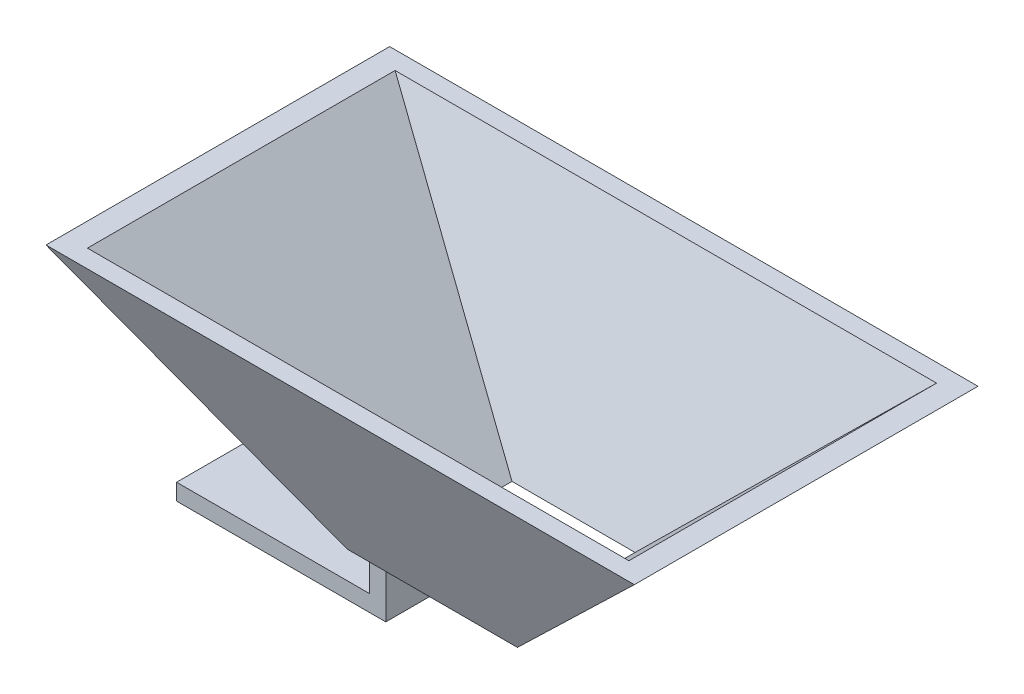
ISO-10303-21;
HEADER;
FILE_DESCRIPTION(('STEP AP214'),'2;1');
FILE_NAME('part.step','',(''),(''),'','','');
FILE_SCHEMA(('AUTOMOTIVE_DESIGN { 1 0 10303 214 1 1 1 1 }'));
ENDSEC;
DATA;
#1=APPLICATION_CONTEXT('core data for automotive mechanical design processes');
#2=APPLICATION_PROTOCOL_DEFINITION('international standard','automotive_design',2000,#1);
#3=PRODUCT_CONTEXT('',#1,'mechanical');
#4=PRODUCT('Part','Part','',(#3));
#5=PRODUCT_RELATED_PRODUCT_CATEGORY('part','',(#4));
#6=PRODUCT_DEFINITION_FORMATION('','',#4);
#7=PRODUCT_DEFINITION_CONTEXT('part definition',#1,'design');
#8=PRODUCT_DEFINITION('design','',#6,#7);
#9=PRODUCT_DEFINITION_SHAPE('','',#8);
#10=(LENGTH_UNIT() NAMED_UNIT(*) SI_UNIT(.MILLI.,.METRE.));
#11=(NAMED_UNIT(*) PLANE_ANGLE_UNIT() SI_UNIT($,.RADIAN.));
#12=(NAMED_UNIT(*) SI_UNIT($,.STERADIAN.) SOLID_ANGLE_UNIT());
#13=UNCERTAINTY_MEASURE_WITH_UNIT(LENGTH_MEASURE(1.E-05),#10,'distance_accuracy_value','');
#14=(GEOMETRIC_REPRESENTATION_CONTEXT(3) GLOBAL_UNCERTAINTY_ASSIGNED_CONTEXT((#13)) GLOBAL_UNIT_ASSIGNED_CONTEXT((#10,
#11,#12)) REPRESENTATION_CONTEXT('',''));
#15=CARTESIAN_POINT('',(0.,0.,0.));
#16=DIRECTION('',(0.,0.,1.));
#17=DIRECTION('',(1.,0.,0.));
#18=AXIS2_PLACEMENT_3D('',#15,#16,#17);
#19=CARTESIAN_POINT('',(-24.7137028274141,0.,10.0496971461617));
#20=DIRECTION('',(1.,0.,0.));
#21=DIRECTION('',(0.,0.,-1.));
#22=AXIS2_PLACEMENT_3D('',#19,#20,#21);
#23=PLANE('',#22);
#24=DIRECTION('',(0.,0.,-1.));
#25=VECTOR('',#24,1.);
#26=CARTESIAN_POINT('',(-24.7137028274141,-16.,10.0496971461617));
#27=LINE('',#26,#25);
#28=CARTESIAN_POINT('',(-24.7137028274141,-16.,10.0496971461617));
#29=VERTEX_POINT('',#28);
#30=CARTESIAN_POINT('',(-24.7137028274141,-16.,-9.95030285383827));
#31=VERTEX_POINT('',#30);
#32=EDGE_CURVE('E228',#29,#31,#27,.T.);
#33=ORIENTED_EDGE('',*,*,#32,.F.);
#34=DIRECTION('',(0.,-1.,0.));
#35=VECTOR('',#34,1.);
#36=CARTESIAN_POINT('',(-24.7137028274141,0.,10.0496971461617));
#37=LINE('',#36,#35);
#38=CARTESIAN_POINT('',(-24.7137028274141,-1.6801008111903,10.0496971461617));
#39=VERTEX_POINT('',#38);
#40=EDGE_CURVE('E234',#39,#29,#37,.T.);
#41=ORIENTED_EDGE('',*,*,#40,.F.);
#42=DIRECTION('',(0.,0.,-1.));
#43=VECTOR('',#42,1.);
#44=CARTESIAN_POINT('',(-24.7137028274141,-1.68010081119031,0.));
#45=LINE('',#44,#43);
#46=CARTESIAN_POINT('',(-24.7137028274141,-1.6801008111903,-9.95030285383827));
#47=VERTEX_POINT('',#46);
#48=EDGE_CURVE('E13',#39,#47,#45,.T.);
#49=ORIENTED_EDGE('',*,*,#48,.T.);
#50=DIRECTION('',(0.,-1.,0.));
#51=VECTOR('',#50,1.);
#52=CARTESIAN_POINT('',(-24.7137028274141,0.,-9.95030285383827));
#53=LINE('',#52,#51);
#54=EDGE_CURVE('E236',#47,#31,#53,.T.);
#55=ORIENTED_EDGE('',*,*,#54,.T.);
#56=EDGE_LOOP('',(#33,#41,#49,#55));
#57=FACE_BOUND('',#56,.T.);
#58=ADVANCED_FACE('F96',(#57),#23,.F.);
#59=CARTESIAN_POINT('',(-12.9520709933485,-13.2111124132154,0.));
#60=DIRECTION('',(0.700071410926057,0.714072839144579,0.));
#61=DIRECTION('',(-0.714072839144579,0.700071410926057,0.));
#62=AXIS2_PLACEMENT_3D('',#59,#60,#61);
#63=PLANE('',#62);
#64=ORIENTED_EDGE('',*,*,#48,.F.);
#65=DIRECTION('',(-0.714072839144579,0.700071410926057,0.));
#66=VECTOR('',#65,1.);
#67=CARTESIAN_POINT('',(-23.5139884711183,-2.85629135657831,10.0496971461617));
#68=LINE('',#67,#66);
#69=CARTESIAN_POINT('',(-59.2176304283473,32.1472791897246,10.0496971461617));
#70=VERTEX_POINT('',#69);
#71=EDGE_CURVE('E276',#39,#70,#68,.T.);
#72=ORIENTED_EDGE('',*,*,#71,.T.);
#73=DIRECTION('',(0.,0.,-1.));
#74=VECTOR('',#73,1.);
#75=CARTESIAN_POINT('',(-59.2176304283473,32.1472791897246,10.0496971461617));
#76=LINE('',#75,#74);
#77=CARTESIAN_POINT('',(-59.2176304283473,32.1472791897246,-9.95030285383827));
#78=VERTEX_POINT('',#77);
#79=EDGE_CURVE('E279',#70,#78,#76,.T.);
#80=ORIENTED_EDGE('',*,*,#79,.T.);
#81=DIRECTION('',(0.714072839144579,-0.700071410926057,0.));
#82=VECTOR('',#81,1.);
#83=CARTESIAN_POINT('',(-59.2176304283473,32.1472791897246,-9.95030285383827));
#84=LINE('',#83,#82);
#85=EDGE_CURVE('E116',#78,#47,#84,.T.);
#86=ORIENTED_EDGE('',*,*,#85,.T.);
#87=EDGE_LOOP('',(#64,#72,#80,#86));
#88=FACE_BOUND('',#87,.T.);
#89=ADVANCED_FACE('F437',(#88),#63,.F.);
#90=CARTESIAN_POINT('',(-17.8002856437042,-2.85629135657831,-15.));
#91=DIRECTION('',(-0.700071410926057,-0.714072839144579,0.));
#92=DIRECTION('',(0.,0.,1.));
#93=AXIS2_PLACEMENT_3D('',#90,#91,#92);
#94=PLANE('',#93);
#95=DIRECTION('',(0.,0.,1.));
#96=VECTOR('',#95,1.);
#97=CARTESIAN_POINT('',(-20.7137028274141,0.,0.));
#98=LINE('',#97,#96);
#99=CARTESIAN_POINT('',(-20.7137028274141,0.,-19.3863424398923));
#100=VERTEX_POINT('',#99);
#101=CARTESIAN_POINT('',(-20.7137028274141,0.,-9.95030285383827));
#102=VERTEX_POINT('',#101);
#103=EDGE_CURVE('E374',#100,#102,#98,.T.);
#104=ORIENTED_EDGE('',*,*,#103,.T.);
#105=DIRECTION('',(0.714072839144579,-0.700071410926057,0.));
#106=VECTOR('',#105,1.);
#107=CARTESIAN_POINT('',(-56.4173447846431,35.0035705463029,-9.95030285383827));
#108=LINE('',#107,#106);
#109=CARTESIAN_POINT('',(-56.4173447846431,35.0035705463029,-9.95030285383827));
#110=VERTEX_POINT('',#109);
#111=EDGE_CURVE('E265',#110,#102,#108,.T.);
#112=ORIENTED_EDGE('',*,*,#111,.F.);
#113=DIRECTION('',(0.,0.,-1.));
#114=VECTOR('',#113,1.);
#115=CARTESIAN_POINT('',(-56.4173447846431,35.0035705463029,10.0496971461617));
#116=LINE('',#115,#114);
#117=CARTESIAN_POINT('',(-56.4173447846431,35.0035705463029,10.0496971461617));
#118=VERTEX_POINT('',#117);
#119=EDGE_CURVE('E311',#118,#110,#116,.T.);
#120=ORIENTED_EDGE('',*,*,#119,.F.);
#121=DIRECTION('',(-0.714072839144579,0.700071410926057,0.));
#122=VECTOR('',#121,1.);
#123=CARTESIAN_POINT('',(-20.7137028274141,0.,10.0496971461617));
#124=LINE('',#123,#122);
#125=CARTESIAN_POINT('',(-20.7137028274141,0.,10.0496971461617));
#126=VERTEX_POINT('',#125);
#127=EDGE_CURVE('E315',#126,#118,#124,.T.);
#128=ORIENTED_EDGE('',*,*,#127,.F.);
#129=CARTESIAN_POINT('',(-20.7137028274141,0.,19.3863424398923));
#130=VERTEX_POINT('',#129);
#131=EDGE_CURVE('E365',#126,#130,#98,.T.);
#132=ORIENTED_EDGE('',*,*,#131,.T.);
#133=DIRECTION('',(-0.681075434754826,0.667721014465515,0.300474456509482));
#134=VECTOR('',#133,1.);
#135=CARTESIAN_POINT('',(-11.0263036560056,-9.49745016804757,15.1124898642709));
#136=LINE('',#135,#134);
#137=CARTESIAN_POINT('',(-71.7137028274141,50.,41.8863424398923));
#138=VERTEX_POINT('',#137);
#139=EDGE_CURVE('E362',#130,#138,#136,.T.);
#140=ORIENTED_EDGE('',*,*,#139,.T.);
#141=DIRECTION('',(0.,0.,1.));
#142=VECTOR('',#141,1.);
#143=CARTESIAN_POINT('',(-71.7137028274141,50.,0.));
#144=LINE('',#143,#142);
#145=CARTESIAN_POINT('',(-71.7137028274141,50.,-41.8863424398923));
#146=VERTEX_POINT('',#145);
#147=EDGE_CURVE('E329',#146,#138,#144,.T.);
#148=ORIENTED_EDGE('',*,*,#147,.F.);
#149=DIRECTION('',(-0.681075434754826,0.667721014465515,-0.300474456509482));
#150=VECTOR('',#149,1.);
#151=CARTESIAN_POINT('',(-3.2497643542088,-17.121508307064,-11.6816637017134));
#152=LINE('',#151,#150);
#153=EDGE_CURVE('E371',#100,#146,#152,.T.);
#154=ORIENTED_EDGE('',*,*,#153,.F.);
#155=EDGE_LOOP('',(#104,#112,#120,#128,#132,#140,#148,#154));
#156=FACE_BOUND('',#155,.T.);
#157=ADVANCED_FACE('F98',(#156),#94,.T.);
#158=CARTESIAN_POINT('',(-15.,-1.64145870931519,18.6476860207004));
#159=DIRECTION('',(0.,-0.410364677328798,0.911921505175107));
#160=DIRECTION('',(1.,0.,0.));
#161=AXIS2_PLACEMENT_3D('',#158,#159,#160);
#162=PLANE('',#161);
#163=DIRECTION('',(1.,0.,0.));
#164=VECTOR('',#163,1.);
#165=CARTESIAN_POINT('',(0.,0.,19.3863424398923));
#166=LINE('',#165,#164);
#167=CARTESIAN_POINT('',(20.7137028274141,0.,19.3863424398923));
#168=VERTEX_POINT('',#167);
#169=EDGE_CURVE('E106',#130,#168,#166,.T.);
#170=ORIENTED_EDGE('',*,*,#169,.T.);
#171=DIRECTION('',(0.681075434754825,0.667721014465515,0.300474456509482));
#172=VECTOR('',#171,1.);
#173=CARTESIAN_POINT('',(3.24976435420881,-17.121508307064,11.6816637017135));
#174=LINE('',#173,#172);
#175=CARTESIAN_POINT('',(71.7137028274141,50.,41.8863424398923));
#176=VERTEX_POINT('',#175);
#177=EDGE_CURVE('E358',#168,#176,#174,.T.);
#178=ORIENTED_EDGE('',*,*,#177,.T.);
#179=DIRECTION('',(1.,0.,0.));
#180=VECTOR('',#179,1.);
#181=CARTESIAN_POINT('',(0.,50.,41.8863424398923));
#182=LINE('',#181,#180);
#183=EDGE_CURVE('E366',#138,#176,#182,.T.);
#184=ORIENTED_EDGE('',*,*,#183,.F.);
#185=ORIENTED_EDGE('',*,*,#139,.F.);
#186=EDGE_LOOP('',(#170,#178,#184,#185));
#187=FACE_BOUND('',#186,.T.);
#188=ADVANCED_FACE('F397',(#187),#162,.T.);
#189=CARTESIAN_POINT('',(17.8002856437042,-2.85629135657831,15.));
#190=DIRECTION('',(0.700071410926058,-0.714072839144579,0.));
#191=DIRECTION('',(0.,0.,-1.));
#192=AXIS2_PLACEMENT_3D('',#189,#190,#191);
#193=PLANE('',#192);
#194=DIRECTION('',(0.,0.,-1.));
#195=VECTOR('',#194,1.);
#196=CARTESIAN_POINT('',(20.7137028274141,0.,0.));
#197=LINE('',#196,#195);
#198=CARTESIAN_POINT('',(20.7137028274141,0.,-19.3863424398923));
#199=VERTEX_POINT('',#198);
#200=EDGE_CURVE('E361',#168,#199,#197,.T.);
#201=ORIENTED_EDGE('',*,*,#200,.T.);
#202=DIRECTION('',(0.681075434754826,0.667721014465515,-0.300474456509482));
#203=VECTOR('',#202,1.);
#204=CARTESIAN_POINT('',(11.0263036560056,-9.49745016804758,-15.1124898642708));
#205=LINE('',#204,#203);
#206=CARTESIAN_POINT('',(71.7137028274141,50.,-41.8863424398923));
#207=VERTEX_POINT('',#206);
#208=EDGE_CURVE('E367',#199,#207,#205,.T.);
#209=ORIENTED_EDGE('',*,*,#208,.T.);
#210=DIRECTION('',(0.,0.,-1.));
#211=VECTOR('',#210,1.);
#212=CARTESIAN_POINT('',(71.7137028274141,50.,0.));
#213=LINE('',#212,#211);
#214=EDGE_CURVE('E385',#176,#207,#213,.T.);
#215=ORIENTED_EDGE('',*,*,#214,.F.);
#216=ORIENTED_EDGE('',*,*,#177,.F.);
#217=EDGE_LOOP('',(#201,#209,#215,#216));
#218=FACE_BOUND('',#217,.T.);
#219=ADVANCED_FACE('F405',(#218),#193,.T.);
#220=CARTESIAN_POINT('',(15.,-1.64145870931519,-18.6476860207004));
#221=DIRECTION('',(0.,-0.410364677328798,-0.911921505175106));
#222=DIRECTION('',(-1.,0.,0.));
#223=AXIS2_PLACEMENT_3D('',#220,#221,#222);
#224=PLANE('',#223);
#225=DIRECTION('',(-1.,0.,0.));
#226=VECTOR('',#225,1.);
#227=CARTESIAN_POINT('',(0.,0.,-19.3863424398923));
#228=LINE('',#227,#226);
#229=EDGE_CURVE('E370',#199,#100,#228,.T.);
#230=ORIENTED_EDGE('',*,*,#229,.T.);
#231=ORIENTED_EDGE('',*,*,#153,.T.);
#232=DIRECTION('',(-1.,0.,0.));
#233=VECTOR('',#232,1.);
#234=CARTESIAN_POINT('',(0.,50.,-41.8863424398923));
#235=LINE('',#234,#233);
#236=EDGE_CURVE('E388',#207,#146,#235,.T.);
#237=ORIENTED_EDGE('',*,*,#236,.F.);
#238=ORIENTED_EDGE('',*,*,#208,.F.);
#239=EDGE_LOOP('',(#230,#231,#237,#238));
#240=FACE_BOUND('',#239,.T.);
#241=ADVANCED_FACE('F408',(#240),#224,.T.);
#242=CARTESIAN_POINT('',(0.,0.,0.));
#243=DIRECTION('',(0.,1.,0.));
#244=DIRECTION('',(0.,0.,1.));
#245=AXIS2_PLACEMENT_3D('',#242,#243,#244);
#246=PLANE('',#245);
#247=DIRECTION('',(-1.,0.,0.));
#248=VECTOR('',#247,1.);
#249=CARTESIAN_POINT('',(0.,0.,-15.));
#250=LINE('',#249,#248);
#251=CARTESIAN_POINT('',(15.,0.,-15.));
#252=VERTEX_POINT('',#251);
#253=CARTESIAN_POINT('',(-15.,0.,-15.));
#254=VERTEX_POINT('',#253);
#255=EDGE_CURVE('E339',#252,#254,#250,.T.);
#256=ORIENTED_EDGE('',*,*,#255,.T.);
#257=DIRECTION('',(0.,0.,1.));
#258=VECTOR('',#257,1.);
#259=CARTESIAN_POINT('',(-15.,0.,0.));
#260=LINE('',#259,#258);
#261=CARTESIAN_POINT('',(-15.,0.,15.));
#262=VERTEX_POINT('',#261);
#263=EDGE_CURVE('E344',#254,#262,#260,.T.);
#264=ORIENTED_EDGE('',*,*,#263,.T.);
#265=DIRECTION('',(1.,0.,0.));
#266=VECTOR('',#265,1.);
#267=CARTESIAN_POINT('',(0.,0.,15.));
#268=LINE('',#267,#266);
#269=CARTESIAN_POINT('',(15.,0.,15.));
#270=VERTEX_POINT('',#269);
#271=EDGE_CURVE('E326',#262,#270,#268,.T.);
#272=ORIENTED_EDGE('',*,*,#271,.T.);
#273=DIRECTION('',(0.,0.,-1.));
#274=VECTOR('',#273,1.);
#275=CARTESIAN_POINT('',(15.,0.,0.));
#276=LINE('',#275,#274);
#277=EDGE_CURVE('E333',#270,#252,#276,.T.);
#278=ORIENTED_EDGE('',*,*,#277,.T.);
#279=EDGE_LOOP('',(#256,#264,#272,#278));
#280=FACE_BOUND('',#279,.T.);
#281=ORIENTED_EDGE('',*,*,#103,.F.);
#282=ORIENTED_EDGE('',*,*,#229,.F.);
#283=ORIENTED_EDGE('',*,*,#200,.F.);
#284=ORIENTED_EDGE('',*,*,#169,.F.);
#285=ORIENTED_EDGE('',*,*,#131,.F.);
#286=DIRECTION('',(0.,0.,1.));
#287=VECTOR('',#286,1.);
#288=CARTESIAN_POINT('',(-20.7137028274141,0.,10.0496971461617));
#289=LINE('',#288,#287);
#290=EDGE_CURVE('E288',#102,#126,#289,.T.);
#291=ORIENTED_EDGE('',*,*,#290,.F.);
#292=EDGE_LOOP('',(#281,#282,#283,#284,#285,#291));
#293=FACE_BOUND('',#292,.T.);
#294=ADVANCED_FACE('F403',(#280,#293),#246,.F.);
#295=CARTESIAN_POINT('',(0.,50.,0.));
#296=DIRECTION('',(0.,1.,0.));
#297=DIRECTION('',(0.,0.,1.));
#298=AXIS2_PLACEMENT_3D('',#295,#296,#297);
#299=PLANE('',#298);
#300=DIRECTION('',(1.,0.,0.));
#301=VECTOR('',#300,1.);
#302=CARTESIAN_POINT('',(0.,50.,37.5));
#303=LINE('',#302,#301);
#304=CARTESIAN_POINT('',(-66.,50.,37.5));
#305=VERTEX_POINT('',#304);
#306=CARTESIAN_POINT('',(66.,50.,37.5));
#307=VERTEX_POINT('',#306);
#308=EDGE_CURVE('E350',#305,#307,#303,.T.);
#309=ORIENTED_EDGE('',*,*,#308,.F.);
#310=DIRECTION('',(0.,0.,1.));
#311=VECTOR('',#310,1.);
#312=CARTESIAN_POINT('',(-66.,50.,0.));
#313=LINE('',#312,#311);
#314=CARTESIAN_POINT('',(-66.,50.,-37.5));
#315=VERTEX_POINT('',#314);
#316=EDGE_CURVE('E325',#315,#305,#313,.T.);
#317=ORIENTED_EDGE('',*,*,#316,.F.);
#318=DIRECTION('',(-1.,0.,0.));
#319=VECTOR('',#318,1.);
#320=CARTESIAN_POINT('',(0.,50.,-37.5));
#321=LINE('',#320,#319);
#322=CARTESIAN_POINT('',(66.,50.,-37.5));
#323=VERTEX_POINT('',#322);
#324=EDGE_CURVE('E354',#323,#315,#321,.T.);
#325=ORIENTED_EDGE('',*,*,#324,.F.);
#326=DIRECTION('',(0.,0.,-1.));
#327=VECTOR('',#326,1.);
#328=CARTESIAN_POINT('',(66.,50.,0.));
#329=LINE('',#328,#327);
#330=EDGE_CURVE('E352',#307,#323,#329,.T.);
#331=ORIENTED_EDGE('',*,*,#330,.F.);
#332=EDGE_LOOP('',(#309,#317,#325,#331));
#333=FACE_BOUND('',#332,.T.);
#334=ORIENTED_EDGE('',*,*,#183,.T.);
#335=ORIENTED_EDGE('',*,*,#214,.T.);
#336=ORIENTED_EDGE('',*,*,#236,.T.);
#337=ORIENTED_EDGE('',*,*,#147,.T.);
#338=EDGE_LOOP('',(#334,#335,#336,#337));
#339=FACE_BOUND('',#338,.T.);
#340=ADVANCED_FACE('F392',(#333,#339),#299,.T.);
#341=CARTESIAN_POINT('',(-15.,0.,15.));
#342=DIRECTION('',(0.,-0.410364677328798,0.911921505175107));
#343=DIRECTION('',(1.,0.,0.));
#344=AXIS2_PLACEMENT_3D('',#341,#342,#343);
#345=PLANE('',#344);
#346=ORIENTED_EDGE('',*,*,#271,.F.);
#347=DIRECTION('',(-0.681075434754825,0.667721014465515,0.300474456509482));
#348=VECTOR('',#347,1.);
#349=CARTESIAN_POINT('',(-40.5,25.,26.25));
#350=LINE('',#349,#348);
#351=EDGE_CURVE('E347',#262,#305,#350,.T.);
#352=ORIENTED_EDGE('',*,*,#351,.T.);
#353=ORIENTED_EDGE('',*,*,#308,.T.);
#354=DIRECTION('',(0.681075434754825,0.667721014465515,0.300474456509482));
#355=VECTOR('',#354,1.);
#356=CARTESIAN_POINT('',(40.5,25.,26.25));
#357=LINE('',#356,#355);
#358=EDGE_CURVE('E330',#270,#307,#357,.T.);
#359=ORIENTED_EDGE('',*,*,#358,.F.);
#360=EDGE_LOOP('',(#346,#352,#353,#359));
#361=FACE_BOUND('',#360,.T.);
#362=ADVANCED_FACE('F455',(#361),#345,.F.);
#363=CARTESIAN_POINT('',(15.,0.,15.));
#364=DIRECTION('',(0.700071410926058,-0.714072839144579,0.));
#365=DIRECTION('',(0.,0.,-1.));
#366=AXIS2_PLACEMENT_3D('',#363,#364,#365);
#367=PLANE('',#366);
#368=ORIENTED_EDGE('',*,*,#277,.F.);
#369=ORIENTED_EDGE('',*,*,#358,.T.);
#370=ORIENTED_EDGE('',*,*,#330,.T.);
#371=DIRECTION('',(0.681075434754825,0.667721014465515,-0.300474456509482));
#372=VECTOR('',#371,1.);
#373=CARTESIAN_POINT('',(40.5,25.,-26.25));
#374=LINE('',#373,#372);
#375=EDGE_CURVE('E336',#252,#323,#374,.T.);
#376=ORIENTED_EDGE('',*,*,#375,.F.);
#377=EDGE_LOOP('',(#368,#369,#370,#376));
#378=FACE_BOUND('',#377,.T.);
#379=ADVANCED_FACE('F458',(#378),#367,.F.);
#380=CARTESIAN_POINT('',(15.,0.,-15.));
#381=DIRECTION('',(0.,-0.410364677328798,-0.911921505175106));
#382=DIRECTION('',(-1.,0.,0.));
#383=AXIS2_PLACEMENT_3D('',#380,#381,#382);
#384=PLANE('',#383);
#385=ORIENTED_EDGE('',*,*,#255,.F.);
#386=ORIENTED_EDGE('',*,*,#375,.T.);
#387=ORIENTED_EDGE('',*,*,#324,.T.);
#388=DIRECTION('',(-0.681075434754826,0.667721014465515,-0.300474456509482));
#389=VECTOR('',#388,1.);
#390=CARTESIAN_POINT('',(-40.5,25.,-26.25));
#391=LINE('',#390,#389);
#392=EDGE_CURVE('E342',#254,#315,#391,.T.);
#393=ORIENTED_EDGE('',*,*,#392,.F.);
#394=EDGE_LOOP('',(#385,#386,#387,#393));
#395=FACE_BOUND('',#394,.T.);
#396=ADVANCED_FACE('F462',(#395),#384,.F.);
#397=CARTESIAN_POINT('',(-15.,0.,-15.));
#398=DIRECTION('',(-0.700071410926057,-0.714072839144579,0.));
#399=DIRECTION('',(0.,0.,1.));
#400=AXIS2_PLACEMENT_3D('',#397,#398,#399);
#401=PLANE('',#400);
#402=ORIENTED_EDGE('',*,*,#263,.F.);
#403=ORIENTED_EDGE('',*,*,#392,.T.);
#404=ORIENTED_EDGE('',*,*,#316,.T.);
#405=ORIENTED_EDGE('',*,*,#351,.F.);
#406=EDGE_LOOP('',(#402,#403,#404,#405));
#407=FACE_BOUND('',#406,.T.);
#408=ADVANCED_FACE('F454',(#407),#401,.F.);
#409=CARTESIAN_POINT('',(-59.2176304283473,32.1472791897246,-9.95030285383827));
#410=DIRECTION('',(0.,0.,1.));
#411=DIRECTION('',(0.,-1.,0.));
#412=AXIS2_PLACEMENT_3D('',#409,#410,#411);
#413=PLANE('',#412);
#414=ORIENTED_EDGE('',*,*,#111,.T.);
#415=DIRECTION('',(0.,1.,0.));
#416=VECTOR('',#415,1.);
#417=CARTESIAN_POINT('',(-20.7137028274141,0.,-9.95030285383827));
#418=LINE('',#417,#416);
#419=CARTESIAN_POINT('',(-20.7137028274141,-20.,-9.95030285383827));
#420=VERTEX_POINT('',#419);
#421=EDGE_CURVE('E298',#420,#102,#418,.T.);
#422=ORIENTED_EDGE('',*,*,#421,.F.);
#423=DIRECTION('',(1.,0.,0.));
#424=VECTOR('',#423,1.);
#425=CARTESIAN_POINT('',(-20.7137028274141,-20.,-9.95030285383827));
#426=LINE('',#425,#424);
#427=CARTESIAN_POINT('',(-71.7137028274141,-20.,-9.95030285383827));
#428=VERTEX_POINT('',#427);
#429=EDGE_CURVE('E241',#428,#420,#426,.T.);
#430=ORIENTED_EDGE('',*,*,#429,.F.);
#431=DIRECTION('',(0.,-1.,0.));
#432=VECTOR('',#431,1.);
#433=CARTESIAN_POINT('',(-71.7137028274141,-20.,-9.95030285383827));
#434=LINE('',#433,#432);
#435=CARTESIAN_POINT('',(-71.7137028274141,-16.,-9.95030285383827));
#436=VERTEX_POINT('',#435);
#437=EDGE_CURVE('E218',#436,#428,#434,.T.);
#438=ORIENTED_EDGE('',*,*,#437,.F.);
#439=DIRECTION('',(1.,0.,0.));
#440=VECTOR('',#439,1.);
#441=CARTESIAN_POINT('',(-71.7137028274141,-16.,-9.95030285383827));
#442=LINE('',#441,#440);
#443=EDGE_CURVE('E213',#436,#31,#442,.T.);
#444=ORIENTED_EDGE('',*,*,#443,.T.);
#445=ORIENTED_EDGE('',*,*,#54,.F.);
#446=ORIENTED_EDGE('',*,*,#85,.F.);
#447=DIRECTION('',(0.700071410926057,0.714072839144579,0.));
#448=VECTOR('',#447,1.);
#449=CARTESIAN_POINT('',(-59.2176304283473,32.1472791897246,-9.95030285383827));
#450=LINE('',#449,#448);
#451=EDGE_CURVE('E283',#78,#110,#450,.T.);
#452=ORIENTED_EDGE('',*,*,#451,.T.);
#453=EDGE_LOOP('',(#414,#422,#430,#438,#444,#445,#446,#452));
#454=FACE_BOUND('',#453,.T.);
#455=ADVANCED_FACE('F411',(#454),#413,.F.);
#456=CARTESIAN_POINT('',(-23.5139884711183,-2.85629135657831,10.0496971461617));
#457=DIRECTION('',(0.,0.,-1.));
#458=DIRECTION('',(0.,1.,0.));
#459=AXIS2_PLACEMENT_3D('',#456,#457,#458);
#460=PLANE('',#459);
#461=DIRECTION('',(0.,1.,0.));
#462=VECTOR('',#461,1.);
#463=CARTESIAN_POINT('',(-20.7137028274141,0.,10.0496971461617));
#464=LINE('',#463,#462);
#465=CARTESIAN_POINT('',(-20.7137028274141,-20.,10.0496971461617));
#466=VERTEX_POINT('',#465);
#467=EDGE_CURVE('E254',#466,#126,#464,.T.);
#468=ORIENTED_EDGE('',*,*,#467,.T.);
#469=ORIENTED_EDGE('',*,*,#127,.T.);
#470=DIRECTION('',(0.700071410926057,0.714072839144579,0.));
#471=VECTOR('',#470,1.);
#472=CARTESIAN_POINT('',(-59.2176304283473,32.1472791897246,10.0496971461617));
#473=LINE('',#472,#471);
#474=EDGE_CURVE('E320',#70,#118,#473,.T.);
#475=ORIENTED_EDGE('',*,*,#474,.F.);
#476=ORIENTED_EDGE('',*,*,#71,.F.);
#477=ORIENTED_EDGE('',*,*,#40,.T.);
#478=DIRECTION('',(1.,0.,0.));
#479=VECTOR('',#478,1.);
#480=CARTESIAN_POINT('',(-71.7137028274141,-16.,10.0496971461617));
#481=LINE('',#480,#479);
#482=CARTESIAN_POINT('',(-71.7137028274141,-16.,10.0496971461617));
#483=VERTEX_POINT('',#482);
#484=EDGE_CURVE('E210',#483,#29,#481,.T.);
#485=ORIENTED_EDGE('',*,*,#484,.F.);
#486=DIRECTION('',(0.,1.,0.));
#487=VECTOR('',#486,1.);
#488=CARTESIAN_POINT('',(-71.7137028274141,-20.,10.0496971461617));
#489=LINE('',#488,#487);
#490=CARTESIAN_POINT('',(-71.7137028274141,-20.,10.0496971461617));
#491=VERTEX_POINT('',#490);
#492=EDGE_CURVE('E219',#491,#483,#489,.T.);
#493=ORIENTED_EDGE('',*,*,#492,.F.);
#494=DIRECTION('',(1.,0.,0.));
#495=VECTOR('',#494,1.);
#496=CARTESIAN_POINT('',(-20.7137028274141,-20.,10.0496971461617));
#497=LINE('',#496,#495);
#498=EDGE_CURVE('E259',#491,#466,#497,.T.);
#499=ORIENTED_EDGE('',*,*,#498,.T.);
#500=EDGE_LOOP('',(#468,#469,#475,#476,#477,#485,#493,#499));
#501=FACE_BOUND('',#500,.T.);
#502=ADVANCED_FACE('F232',(#501),#460,.F.);
#503=CARTESIAN_POINT('',(-59.2176304283473,32.1472791897246,10.0496971461617));
#504=DIRECTION('',(0.714072839144579,-0.700071410926057,0.));
#505=DIRECTION('',(0.700071410926057,0.714072839144579,0.));
#506=AXIS2_PLACEMENT_3D('',#503,#504,#505);
#507=PLANE('',#506);
#508=ORIENTED_EDGE('',*,*,#119,.T.);
#509=ORIENTED_EDGE('',*,*,#451,.F.);
#510=ORIENTED_EDGE('',*,*,#79,.F.);
#511=ORIENTED_EDGE('',*,*,#474,.T.);
#512=EDGE_LOOP('',(#508,#509,#510,#511));
#513=FACE_BOUND('',#512,.T.);
#514=ADVANCED_FACE('F446',(#513),#507,.F.);
#515=CARTESIAN_POINT('',(-20.7137028274141,-20.,10.0496971461617));
#516=DIRECTION('',(0.,1.,0.));
#517=DIRECTION('',(0.,0.,1.));
#518=AXIS2_PLACEMENT_3D('',#515,#516,#517);
#519=PLANE('',#518);
#520=ORIENTED_EDGE('',*,*,#498,.F.);
#521=DIRECTION('',(0.,0.,1.));
#522=VECTOR('',#521,1.);
#523=CARTESIAN_POINT('',(-71.7137028274141,-20.,10.0496971461617));
#524=LINE('',#523,#522);
#525=EDGE_CURVE('E225',#428,#491,#524,.T.);
#526=ORIENTED_EDGE('',*,*,#525,.F.);
#527=ORIENTED_EDGE('',*,*,#429,.T.);
#528=DIRECTION('',(0.,0.,-1.));
#529=VECTOR('',#528,1.);
#530=CARTESIAN_POINT('',(-20.7137028274141,-20.,10.0496971461617));
#531=LINE('',#530,#529);
#532=EDGE_CURVE('E258',#466,#420,#531,.T.);
#533=ORIENTED_EDGE('',*,*,#532,.F.);
#534=EDGE_LOOP('',(#520,#526,#527,#533));
#535=FACE_BOUND('',#534,.T.);
#536=ADVANCED_FACE('F420',(#535),#519,.F.);
#537=CARTESIAN_POINT('',(-20.7137028274141,0.,10.0496971461617));
#538=DIRECTION('',(-1.,0.,0.));
#539=DIRECTION('',(0.,0.,1.));
#540=AXIS2_PLACEMENT_3D('',#537,#538,#539);
#541=PLANE('',#540);
#542=ORIENTED_EDGE('',*,*,#532,.T.);
#543=ORIENTED_EDGE('',*,*,#421,.T.);
#544=ORIENTED_EDGE('',*,*,#290,.T.);
#545=ORIENTED_EDGE('',*,*,#467,.F.);
#546=EDGE_LOOP('',(#542,#543,#544,#545));
#547=FACE_BOUND('',#546,.T.);
#548=ADVANCED_FACE('F415',(#547),#541,.F.);
#549=CARTESIAN_POINT('',(-71.7137028274141,-16.,10.0496971461617));
#550=DIRECTION('',(0.,-1.,0.));
#551=DIRECTION('',(0.,0.,-1.));
#552=AXIS2_PLACEMENT_3D('',#549,#550,#551);
#553=PLANE('',#552);
#554=ORIENTED_EDGE('',*,*,#32,.T.);
#555=ORIENTED_EDGE('',*,*,#443,.F.);
#556=DIRECTION('',(0.,0.,-1.));
#557=VECTOR('',#556,1.);
#558=CARTESIAN_POINT('',(-71.7137028274141,-16.,10.0496971461617));
#559=LINE('',#558,#557);
#560=EDGE_CURVE('E206',#483,#436,#559,.T.);
#561=ORIENTED_EDGE('',*,*,#560,.F.);
#562=ORIENTED_EDGE('',*,*,#484,.T.);
#563=EDGE_LOOP('',(#554,#555,#561,#562));
#564=FACE_BOUND('',#563,.T.);
#565=ADVANCED_FACE('F208',(#564),#553,.F.);
#566=CARTESIAN_POINT('',(-71.7137028274141,0.,0.));
#567=DIRECTION('',(-1.,0.,0.));
#568=DIRECTION('',(0.,0.,1.));
#569=AXIS2_PLACEMENT_3D('',#566,#567,#568);
#570=PLANE('',#569);
#571=ORIENTED_EDGE('',*,*,#492,.T.);
#572=ORIENTED_EDGE('',*,*,#560,.T.);
#573=ORIENTED_EDGE('',*,*,#437,.T.);
#574=ORIENTED_EDGE('',*,*,#525,.T.);
#575=EDGE_LOOP('',(#571,#572,#573,#574));
#576=FACE_BOUND('',#575,.T.);
#577=ADVANCED_FACE('F223',(#576),#570,.T.);
#578=CLOSED_SHELL('',(#58,#89,#157,#188,#219,#241,#294,#340,#362,#379,#396,#408,#455,#502,#514,
#536,#548,#565,#577));
#579=MANIFOLD_SOLID_BREP('B2',#578);
#580=ADVANCED_BREP_SHAPE_REPRESENTATION('',(#18,#579),#14);
#581=SHAPE_DEFINITION_REPRESENTATION(#9,#580);
ENDSEC;
END-ISO-10303-21;
